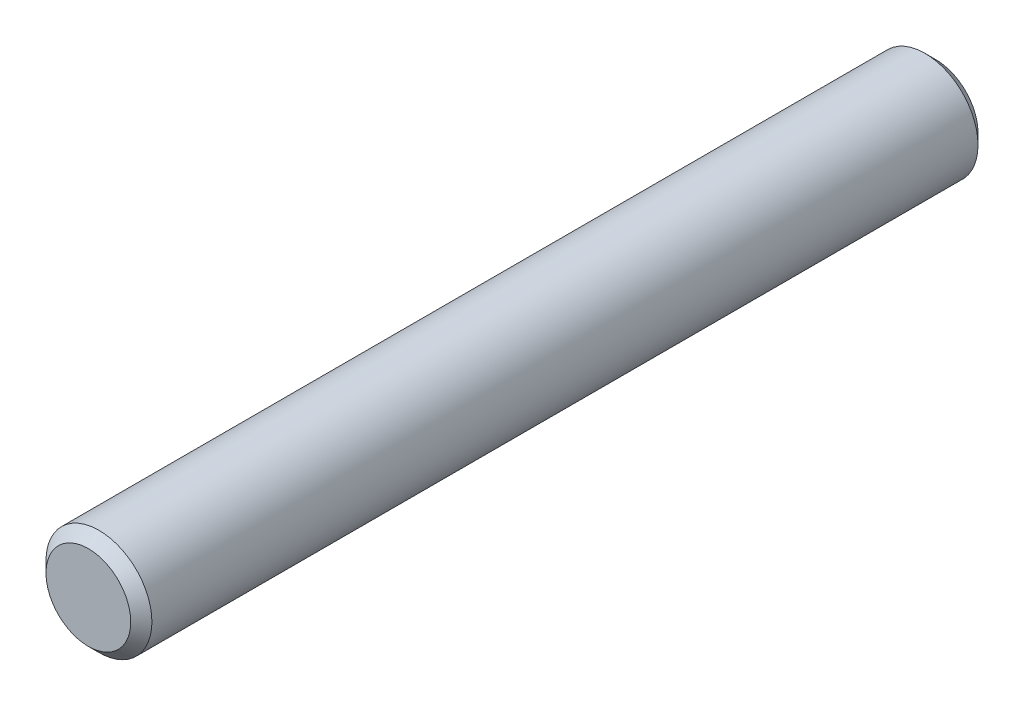
ISO-10303-21;
HEADER;
FILE_DESCRIPTION(('STEP AP214'),'2;1');
FILE_NAME('part.step','',(''),(''),'','','');
FILE_SCHEMA(('AUTOMOTIVE_DESIGN { 1 0 10303 214 1 1 1 1 }'));
ENDSEC;
DATA;
#1=APPLICATION_CONTEXT('core data for automotive mechanical design processes');
#2=APPLICATION_PROTOCOL_DEFINITION('international standard','automotive_design',2000,#1);
#3=PRODUCT_CONTEXT('',#1,'mechanical');
#4=PRODUCT('Part','Part','',(#3));
#5=PRODUCT_RELATED_PRODUCT_CATEGORY('part','',(#4));
#6=PRODUCT_DEFINITION_FORMATION('','',#4);
#7=PRODUCT_DEFINITION_CONTEXT('part definition',#1,'design');
#8=PRODUCT_DEFINITION('design','',#6,#7);
#9=PRODUCT_DEFINITION_SHAPE('','',#8);
#10=(LENGTH_UNIT() NAMED_UNIT(*) SI_UNIT(.MILLI.,.METRE.));
#11=(NAMED_UNIT(*) PLANE_ANGLE_UNIT() SI_UNIT($,.RADIAN.));
#12=(NAMED_UNIT(*) SI_UNIT($,.STERADIAN.) SOLID_ANGLE_UNIT());
#13=UNCERTAINTY_MEASURE_WITH_UNIT(LENGTH_MEASURE(1.E-05),#10,'distance_accuracy_value','');
#14=(GEOMETRIC_REPRESENTATION_CONTEXT(3) GLOBAL_UNCERTAINTY_ASSIGNED_CONTEXT((#13)) GLOBAL_UNIT_ASSIGNED_CONTEXT((#10,
#11,#12)) REPRESENTATION_CONTEXT('',''));
#15=CARTESIAN_POINT('',(0.,0.,0.));
#16=DIRECTION('',(0.,0.,1.));
#17=DIRECTION('',(1.,0.,0.));
#18=AXIS2_PLACEMENT_3D('',#15,#16,#17);
#19=CARTESIAN_POINT('',(0.,0.,25.4));
#20=DIRECTION('',(0.,0.,-1.));
#21=DIRECTION('',(-1.,0.,0.));
#22=AXIS2_PLACEMENT_3D('',#19,#20,#21);
#23=CYLINDRICAL_SURFACE('',#22,3.175);
#24=CARTESIAN_POINT('',(0.,0.,-24.765));
#25=DIRECTION('',(0.,0.,1.));
#26=DIRECTION('',(1.,0.,0.));
#27=AXIS2_PLACEMENT_3D('',#24,#25,#26);
#28=CIRCLE('',#27,3.175);
#29=CARTESIAN_POINT('',(3.175,0.,-24.765));
#30=VERTEX_POINT('',#29);
#31=EDGE_CURVE('E48',#30,#30,#28,.T.);
#32=ORIENTED_EDGE('',*,*,#31,.T.);
#33=EDGE_LOOP('',(#32));
#34=FACE_BOUND('',#33,.T.);
#35=CARTESIAN_POINT('',(0.,0.,24.765));
#36=DIRECTION('',(0.,0.,1.));
#37=DIRECTION('',(1.,0.,0.));
#38=AXIS2_PLACEMENT_3D('',#35,#36,#37);
#39=CIRCLE('',#38,3.175);
#40=CARTESIAN_POINT('',(3.175,0.,24.765));
#41=VERTEX_POINT('',#40);
#42=EDGE_CURVE('E55',#41,#41,#39,.F.);
#43=ORIENTED_EDGE('',*,*,#42,.T.);
#44=EDGE_LOOP('',(#43));
#45=FACE_BOUND('',#44,.T.);
#46=ADVANCED_FACE('F40',(#34,#45),#23,.T.);
#47=CARTESIAN_POINT('',(0.,0.,25.4));
#48=DIRECTION('',(0.,0.,1.));
#49=DIRECTION('',(1.,0.,0.));
#50=AXIS2_PLACEMENT_3D('',#47,#48,#49);
#51=PLANE('',#50);
#52=CARTESIAN_POINT('',(0.,0.,25.4));
#53=DIRECTION('',(0.,0.,1.));
#54=DIRECTION('',(1.,0.,0.));
#55=AXIS2_PLACEMENT_3D('',#52,#53,#54);
#56=CIRCLE('',#55,2.53999999999999);
#57=CARTESIAN_POINT('',(2.53999999999999,0.,25.4));
#58=VERTEX_POINT('',#57);
#59=EDGE_CURVE('E10',#58,#58,#56,.T.);
#60=ORIENTED_EDGE('',*,*,#59,.T.);
#61=EDGE_LOOP('',(#60));
#62=FACE_BOUND('',#61,.T.);
#63=ADVANCED_FACE('F66',(#62),#51,.T.);
#64=CARTESIAN_POINT('',(0.,0.,-25.4));
#65=DIRECTION('',(0.,0.,1.));
#66=DIRECTION('',(1.,0.,0.));
#67=AXIS2_PLACEMENT_3D('',#64,#65,#66);
#68=PLANE('',#67);
#69=CARTESIAN_POINT('',(0.,0.,-25.4));
#70=DIRECTION('',(0.,0.,1.));
#71=DIRECTION('',(1.,0.,0.));
#72=AXIS2_PLACEMENT_3D('',#69,#70,#71);
#73=CIRCLE('',#72,2.54);
#74=CARTESIAN_POINT('',(2.54,0.,-25.4));
#75=VERTEX_POINT('',#74);
#76=EDGE_CURVE('E42',#75,#75,#73,.F.);
#77=ORIENTED_EDGE('',*,*,#76,.T.);
#78=EDGE_LOOP('',(#77));
#79=FACE_BOUND('',#78,.T.);
#80=ADVANCED_FACE('F63',(#79),#68,.F.);
#81=CARTESIAN_POINT('',(0.,0.,-24.765));
#82=DIRECTION('',(0.,0.,1.));
#83=DIRECTION('',(1.,0.,0.));
#84=AXIS2_PLACEMENT_3D('',#81,#82,#83);
#85=CONICAL_SURFACE('',#84,3.175,0.78539816339745);
#86=ORIENTED_EDGE('',*,*,#76,.F.);
#87=EDGE_LOOP('',(#86));
#88=FACE_BOUND('',#87,.T.);
#89=ORIENTED_EDGE('',*,*,#31,.F.);
#90=EDGE_LOOP('',(#89));
#91=FACE_BOUND('',#90,.T.);
#92=ADVANCED_FACE('F62',(#88,#91),#85,.T.);
#93=CARTESIAN_POINT('',(0.,0.,25.4));
#94=DIRECTION('',(0.,0.,-1.));
#95=DIRECTION('',(-1.,0.,0.));
#96=AXIS2_PLACEMENT_3D('',#93,#94,#95);
#97=CONICAL_SURFACE('',#96,2.53999999999999,0.78539816339745);
#98=ORIENTED_EDGE('',*,*,#42,.F.);
#99=EDGE_LOOP('',(#98));
#100=FACE_BOUND('',#99,.T.);
#101=ORIENTED_EDGE('',*,*,#59,.F.);
#102=EDGE_LOOP('',(#101));
#103=FACE_BOUND('',#102,.T.);
#104=ADVANCED_FACE('F39',(#100,#103),#97,.T.);
#105=CLOSED_SHELL('',(#46,#63,#80,#92,#104));
#106=MANIFOLD_SOLID_BREP('B2',#105);
#107=ADVANCED_BREP_SHAPE_REPRESENTATION('',(#18,#106),#14);
#108=SHAPE_DEFINITION_REPRESENTATION(#9,#107);
ENDSEC;
END-ISO-10303-21;
